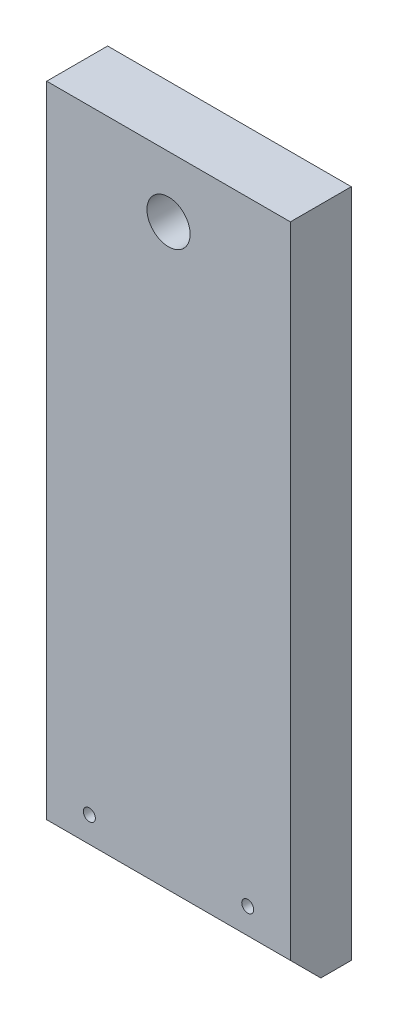
ISO-10303-21;
HEADER;
FILE_DESCRIPTION(('STEP AP214'),'2;1');
FILE_NAME('part.step','',(''),(''),'','','');
FILE_SCHEMA(('AUTOMOTIVE_DESIGN { 1 0 10303 214 1 1 1 1 }'));
ENDSEC;
DATA;
#1=APPLICATION_CONTEXT('core data for automotive mechanical design processes');
#2=APPLICATION_PROTOCOL_DEFINITION('international standard','automotive_design',2000,#1);
#3=PRODUCT_CONTEXT('',#1,'mechanical');
#4=PRODUCT('Part','Part','',(#3));
#5=PRODUCT_RELATED_PRODUCT_CATEGORY('part','',(#4));
#6=PRODUCT_DEFINITION_FORMATION('','',#4);
#7=PRODUCT_DEFINITION_CONTEXT('part definition',#1,'design');
#8=PRODUCT_DEFINITION('design','',#6,#7);
#9=PRODUCT_DEFINITION_SHAPE('','',#8);
#10=(LENGTH_UNIT() NAMED_UNIT(*) SI_UNIT(.MILLI.,.METRE.));
#11=(NAMED_UNIT(*) PLANE_ANGLE_UNIT() SI_UNIT($,.RADIAN.));
#12=(NAMED_UNIT(*) SI_UNIT($,.STERADIAN.) SOLID_ANGLE_UNIT());
#13=UNCERTAINTY_MEASURE_WITH_UNIT(LENGTH_MEASURE(1.E-05),#10,'distance_accuracy_value','');
#14=(GEOMETRIC_REPRESENTATION_CONTEXT(3) GLOBAL_UNCERTAINTY_ASSIGNED_CONTEXT((#13)) GLOBAL_UNIT_ASSIGNED_CONTEXT((#10,
#11,#12)) REPRESENTATION_CONTEXT('',''));
#15=CARTESIAN_POINT('',(0.,0.,0.));
#16=DIRECTION('',(0.,0.,1.));
#17=DIRECTION('',(1.,0.,0.));
#18=AXIS2_PLACEMENT_3D('',#15,#16,#17);
#19=CARTESIAN_POINT('',(0.,0.,6.35));
#20=DIRECTION('',(1.,0.,0.));
#21=DIRECTION('',(0.,0.,-1.));
#22=AXIS2_PLACEMENT_3D('',#19,#20,#21);
#23=PLANE('',#22);
#24=DIRECTION('',(0.,0.,-1.));
#25=VECTOR('',#24,1.);
#26=CARTESIAN_POINT('',(0.,0.,6.35));
#27=LINE('',#26,#25);
#28=CARTESIAN_POINT('',(0.,0.,3.17499999999998));
#29=VERTEX_POINT('',#28);
#30=CARTESIAN_POINT('',(0.,0.,0.));
#31=VERTEX_POINT('',#30);
#32=EDGE_CURVE('E116',#29,#31,#27,.T.);
#33=ORIENTED_EDGE('',*,*,#32,.F.);
#34=DIRECTION('',(0.,-0.707106781186546,-0.707106781186549));
#35=VECTOR('',#34,1.);
#36=CARTESIAN_POINT('',(0.,3.175,6.35));
#37=LINE('',#36,#35);
#38=CARTESIAN_POINT('',(0.,3.175,6.35));
#39=VERTEX_POINT('',#38);
#40=EDGE_CURVE('E11',#29,#39,#37,.F.);
#41=ORIENTED_EDGE('',*,*,#40,.T.);
#42=DIRECTION('',(0.,-1.,0.));
#43=VECTOR('',#42,1.);
#44=CARTESIAN_POINT('',(0.,0.,6.35));
#45=LINE('',#44,#43);
#46=CARTESIAN_POINT('',(0.,69.85,6.35));
#47=VERTEX_POINT('',#46);
#48=EDGE_CURVE('E86',#47,#39,#45,.T.);
#49=ORIENTED_EDGE('',*,*,#48,.F.);
#50=DIRECTION('',(0.,0.,-1.));
#51=VECTOR('',#50,1.);
#52=CARTESIAN_POINT('',(0.,69.85,6.35));
#53=LINE('',#52,#51);
#54=CARTESIAN_POINT('',(0.,69.85,0.));
#55=VERTEX_POINT('',#54);
#56=EDGE_CURVE('E96',#47,#55,#53,.T.);
#57=ORIENTED_EDGE('',*,*,#56,.T.);
#58=DIRECTION('',(0.,-1.,0.));
#59=VECTOR('',#58,1.);
#60=CARTESIAN_POINT('',(0.,0.,0.));
#61=LINE('',#60,#59);
#62=EDGE_CURVE('E105',#55,#31,#61,.T.);
#63=ORIENTED_EDGE('',*,*,#62,.T.);
#64=EDGE_LOOP('',(#33,#41,#49,#57,#63));
#65=FACE_BOUND('',#64,.T.);
#66=ADVANCED_FACE('F33',(#65),#23,.F.);
#67=CARTESIAN_POINT('',(0.,0.,6.35));
#68=DIRECTION('',(0.,1.,0.));
#69=DIRECTION('',(0.,0.,1.));
#70=AXIS2_PLACEMENT_3D('',#67,#68,#69);
#71=PLANE('',#70);
#72=DIRECTION('',(0.,0.,-1.));
#73=VECTOR('',#72,1.);
#74=CARTESIAN_POINT('',(25.4,0.,6.35));
#75=LINE('',#74,#73);
#76=CARTESIAN_POINT('',(25.4,0.,3.17499999999998));
#77=VERTEX_POINT('',#76);
#78=CARTESIAN_POINT('',(25.4,0.,0.));
#79=VERTEX_POINT('',#78);
#80=EDGE_CURVE('E95',#77,#79,#75,.T.);
#81=ORIENTED_EDGE('',*,*,#80,.F.);
#82=DIRECTION('',(-1.,0.,0.));
#83=VECTOR('',#82,1.);
#84=CARTESIAN_POINT('',(0.,0.,3.17499999999998));
#85=LINE('',#84,#83);
#86=EDGE_CURVE('E41',#77,#29,#85,.T.);
#87=ORIENTED_EDGE('',*,*,#86,.T.);
#88=ORIENTED_EDGE('',*,*,#32,.T.);
#89=DIRECTION('',(1.,0.,0.));
#90=VECTOR('',#89,1.);
#91=CARTESIAN_POINT('',(0.,0.,0.));
#92=LINE('',#91,#90);
#93=EDGE_CURVE('E108',#31,#79,#92,.T.);
#94=ORIENTED_EDGE('',*,*,#93,.T.);
#95=EDGE_LOOP('',(#81,#87,#88,#94));
#96=FACE_BOUND('',#95,.T.);
#97=ADVANCED_FACE('F120',(#96),#71,.F.);
#98=CARTESIAN_POINT('',(25.4,0.,6.35));
#99=DIRECTION('',(-1.,0.,0.));
#100=DIRECTION('',(0.,0.,1.));
#101=AXIS2_PLACEMENT_3D('',#98,#99,#100);
#102=PLANE('',#101);
#103=DIRECTION('',(0.,1.,0.));
#104=VECTOR('',#103,1.);
#105=CARTESIAN_POINT('',(25.4,0.,6.35));
#106=LINE('',#105,#104);
#107=CARTESIAN_POINT('',(25.4,3.175,6.35));
#108=VERTEX_POINT('',#107);
#109=CARTESIAN_POINT('',(25.4,69.85,6.35));
#110=VERTEX_POINT('',#109);
#111=EDGE_CURVE('E77',#108,#110,#106,.T.);
#112=ORIENTED_EDGE('',*,*,#111,.F.);
#113=DIRECTION('',(0.,0.707106781186546,0.707106781186549));
#114=VECTOR('',#113,1.);
#115=CARTESIAN_POINT('',(25.4,3.175,6.35));
#116=LINE('',#115,#114);
#117=EDGE_CURVE('E55',#108,#77,#116,.F.);
#118=ORIENTED_EDGE('',*,*,#117,.T.);
#119=ORIENTED_EDGE('',*,*,#80,.T.);
#120=DIRECTION('',(0.,1.,0.));
#121=VECTOR('',#120,1.);
#122=CARTESIAN_POINT('',(25.4,0.,0.));
#123=LINE('',#122,#121);
#124=CARTESIAN_POINT('',(25.4,69.85,0.));
#125=VERTEX_POINT('',#124);
#126=EDGE_CURVE('E92',#79,#125,#123,.T.);
#127=ORIENTED_EDGE('',*,*,#126,.T.);
#128=DIRECTION('',(0.,0.,-1.));
#129=VECTOR('',#128,1.);
#130=CARTESIAN_POINT('',(25.4,69.85,6.35));
#131=LINE('',#130,#129);
#132=EDGE_CURVE('E89',#110,#125,#131,.T.);
#133=ORIENTED_EDGE('',*,*,#132,.F.);
#134=EDGE_LOOP('',(#112,#118,#119,#127,#133));
#135=FACE_BOUND('',#134,.T.);
#136=ADVANCED_FACE('F90',(#135),#102,.F.);
#137=CARTESIAN_POINT('',(0.,69.85,6.35));
#138=DIRECTION('',(0.,-1.,0.));
#139=DIRECTION('',(0.,0.,-1.));
#140=AXIS2_PLACEMENT_3D('',#137,#138,#139);
#141=PLANE('',#140);
#142=DIRECTION('',(-1.,0.,0.));
#143=VECTOR('',#142,1.);
#144=CARTESIAN_POINT('',(0.,69.85,0.));
#145=LINE('',#144,#143);
#146=EDGE_CURVE('E113',#125,#55,#145,.T.);
#147=ORIENTED_EDGE('',*,*,#146,.T.);
#148=ORIENTED_EDGE('',*,*,#56,.F.);
#149=DIRECTION('',(-1.,0.,0.));
#150=VECTOR('',#149,1.);
#151=CARTESIAN_POINT('',(0.,69.85,6.35));
#152=LINE('',#151,#150);
#153=EDGE_CURVE('E82',#110,#47,#152,.T.);
#154=ORIENTED_EDGE('',*,*,#153,.F.);
#155=ORIENTED_EDGE('',*,*,#132,.T.);
#156=EDGE_LOOP('',(#147,#148,#154,#155));
#157=FACE_BOUND('',#156,.T.);
#158=ADVANCED_FACE('F98',(#157),#141,.F.);
#159=CARTESIAN_POINT('',(0.,0.,6.35));
#160=DIRECTION('',(0.,0.,-1.));
#161=DIRECTION('',(-1.,0.,0.));
#162=AXIS2_PLACEMENT_3D('',#159,#160,#161);
#163=PLANE('',#162);
#164=CARTESIAN_POINT('',(20.955,5.842,6.35));
#165=DIRECTION('',(0.,0.,1.));
#166=DIRECTION('',(1.,0.,0.));
#167=AXIS2_PLACEMENT_3D('',#164,#165,#166);
#168=CIRCLE('',#167,0.624999999999999);
#169=CARTESIAN_POINT('',(21.58,5.842,6.35));
#170=VERTEX_POINT('',#169);
#171=EDGE_CURVE('E139',#170,#170,#168,.T.);
#172=ORIENTED_EDGE('',*,*,#171,.F.);
#173=EDGE_LOOP('',(#172));
#174=FACE_BOUND('',#173,.T.);
#175=CARTESIAN_POINT('',(4.445,5.842,6.35));
#176=DIRECTION('',(0.,0.,1.));
#177=DIRECTION('',(1.,0.,0.));
#178=AXIS2_PLACEMENT_3D('',#175,#176,#177);
#179=CIRCLE('',#178,0.625);
#180=CARTESIAN_POINT('',(5.07,5.842,6.35));
#181=VERTEX_POINT('',#180);
#182=EDGE_CURVE('E133',#181,#181,#179,.T.);
#183=ORIENTED_EDGE('',*,*,#182,.F.);
#184=EDGE_LOOP('',(#183));
#185=FACE_BOUND('',#184,.T.);
#186=CARTESIAN_POINT('',(12.7,63.5,6.35));
#187=DIRECTION('',(0.,0.,1.));
#188=DIRECTION('',(1.,0.,0.));
#189=AXIS2_PLACEMENT_3D('',#186,#187,#188);
#190=CIRCLE('',#189,2.25);
#191=CARTESIAN_POINT('',(14.95,63.5,6.35));
#192=VERTEX_POINT('',#191);
#193=EDGE_CURVE('E127',#192,#192,#190,.T.);
#194=ORIENTED_EDGE('',*,*,#193,.F.);
#195=EDGE_LOOP('',(#194));
#196=FACE_BOUND('',#195,.T.);
#197=ORIENTED_EDGE('',*,*,#48,.T.);
#198=DIRECTION('',(1.,0.,0.));
#199=VECTOR('',#198,1.);
#200=CARTESIAN_POINT('',(0.,3.175,6.35));
#201=LINE('',#200,#199);
#202=EDGE_CURVE('E85',#39,#108,#201,.T.);
#203=ORIENTED_EDGE('',*,*,#202,.T.);
#204=ORIENTED_EDGE('',*,*,#111,.T.);
#205=ORIENTED_EDGE('',*,*,#153,.T.);
#206=EDGE_LOOP('',(#197,#203,#204,#205));
#207=FACE_BOUND('',#206,.T.);
#208=ADVANCED_FACE('F80',(#174,#185,#196,#207),#163,.F.);
#209=CARTESIAN_POINT('',(0.,0.,0.));
#210=DIRECTION('',(0.,0.,-1.));
#211=DIRECTION('',(-1.,0.,0.));
#212=AXIS2_PLACEMENT_3D('',#209,#210,#211);
#213=PLANE('',#212);
#214=CARTESIAN_POINT('',(20.955,5.842,0.));
#215=DIRECTION('',(0.,0.,1.));
#216=DIRECTION('',(1.,0.,0.));
#217=AXIS2_PLACEMENT_3D('',#214,#215,#216);
#218=CIRCLE('',#217,0.624999999999999);
#219=CARTESIAN_POINT('',(21.58,5.842,0.));
#220=VERTEX_POINT('',#219);
#221=EDGE_CURVE('E136',#220,#220,#218,.T.);
#222=ORIENTED_EDGE('',*,*,#221,.T.);
#223=EDGE_LOOP('',(#222));
#224=FACE_BOUND('',#223,.T.);
#225=CARTESIAN_POINT('',(4.445,5.842,0.));
#226=DIRECTION('',(0.,0.,1.));
#227=DIRECTION('',(1.,0.,0.));
#228=AXIS2_PLACEMENT_3D('',#225,#226,#227);
#229=CIRCLE('',#228,0.625);
#230=CARTESIAN_POINT('',(5.07,5.842,0.));
#231=VERTEX_POINT('',#230);
#232=EDGE_CURVE('E130',#231,#231,#229,.T.);
#233=ORIENTED_EDGE('',*,*,#232,.T.);
#234=EDGE_LOOP('',(#233));
#235=FACE_BOUND('',#234,.T.);
#236=CARTESIAN_POINT('',(12.7,63.5,0.));
#237=DIRECTION('',(0.,0.,1.));
#238=DIRECTION('',(1.,0.,0.));
#239=AXIS2_PLACEMENT_3D('',#236,#237,#238);
#240=CIRCLE('',#239,2.25);
#241=CARTESIAN_POINT('',(14.95,63.5,0.));
#242=VERTEX_POINT('',#241);
#243=EDGE_CURVE('E109',#242,#242,#240,.T.);
#244=ORIENTED_EDGE('',*,*,#243,.T.);
#245=EDGE_LOOP('',(#244));
#246=FACE_BOUND('',#245,.T.);
#247=ORIENTED_EDGE('',*,*,#62,.F.);
#248=ORIENTED_EDGE('',*,*,#146,.F.);
#249=ORIENTED_EDGE('',*,*,#126,.F.);
#250=ORIENTED_EDGE('',*,*,#93,.F.);
#251=EDGE_LOOP('',(#247,#248,#249,#250));
#252=FACE_BOUND('',#251,.T.);
#253=ADVANCED_FACE('F125',(#224,#235,#246,#252),#213,.T.);
#254=CARTESIAN_POINT('',(12.7,63.5,0.));
#255=DIRECTION('',(0.,0.,1.));
#256=DIRECTION('',(1.,0.,0.));
#257=AXIS2_PLACEMENT_3D('',#254,#255,#256);
#258=CYLINDRICAL_SURFACE('',#257,2.25);
#259=ORIENTED_EDGE('',*,*,#243,.F.);
#260=EDGE_LOOP('',(#259));
#261=FACE_BOUND('',#260,.T.);
#262=ORIENTED_EDGE('',*,*,#193,.T.);
#263=EDGE_LOOP('',(#262));
#264=FACE_BOUND('',#263,.T.);
#265=ADVANCED_FACE('F161',(#261,#264),#258,.F.);
#266=CARTESIAN_POINT('',(4.445,5.842,0.));
#267=DIRECTION('',(0.,0.,1.));
#268=DIRECTION('',(1.,0.,0.));
#269=AXIS2_PLACEMENT_3D('',#266,#267,#268);
#270=CYLINDRICAL_SURFACE('',#269,0.625);
#271=ORIENTED_EDGE('',*,*,#232,.F.);
#272=EDGE_LOOP('',(#271));
#273=FACE_BOUND('',#272,.T.);
#274=ORIENTED_EDGE('',*,*,#182,.T.);
#275=EDGE_LOOP('',(#274));
#276=FACE_BOUND('',#275,.T.);
#277=ADVANCED_FACE('F150',(#273,#276),#270,.F.);
#278=CARTESIAN_POINT('',(20.955,5.842,0.));
#279=DIRECTION('',(0.,0.,1.));
#280=DIRECTION('',(1.,0.,0.));
#281=AXIS2_PLACEMENT_3D('',#278,#279,#280);
#282=CYLINDRICAL_SURFACE('',#281,0.624999999999999);
#283=ORIENTED_EDGE('',*,*,#221,.F.);
#284=EDGE_LOOP('',(#283));
#285=FACE_BOUND('',#284,.T.);
#286=ORIENTED_EDGE('',*,*,#171,.T.);
#287=EDGE_LOOP('',(#286));
#288=FACE_BOUND('',#287,.T.);
#289=ADVANCED_FACE('F147',(#285,#288),#282,.F.);
#290=CARTESIAN_POINT('',(0.,3.175,6.35));
#291=DIRECTION('',(0.,0.707106781186549,-0.707106781186546));
#292=DIRECTION('',(1.,0.,0.));
#293=AXIS2_PLACEMENT_3D('',#290,#291,#292);
#294=PLANE('',#293);
#295=ORIENTED_EDGE('',*,*,#40,.F.);
#296=ORIENTED_EDGE('',*,*,#86,.F.);
#297=ORIENTED_EDGE('',*,*,#117,.F.);
#298=ORIENTED_EDGE('',*,*,#202,.F.);
#299=EDGE_LOOP('',(#295,#296,#297,#298));
#300=FACE_BOUND('',#299,.T.);
#301=ADVANCED_FACE('F35',(#300),#294,.F.);
#302=CLOSED_SHELL('',(#66,#97,#136,#158,#208,#253,#265,#277,#289,#301));
#303=MANIFOLD_SOLID_BREP('B2',#302);
#304=ADVANCED_BREP_SHAPE_REPRESENTATION('',(#18,#303),#14);
#305=SHAPE_DEFINITION_REPRESENTATION(#9,#304);
ENDSEC;
END-ISO-10303-21;
